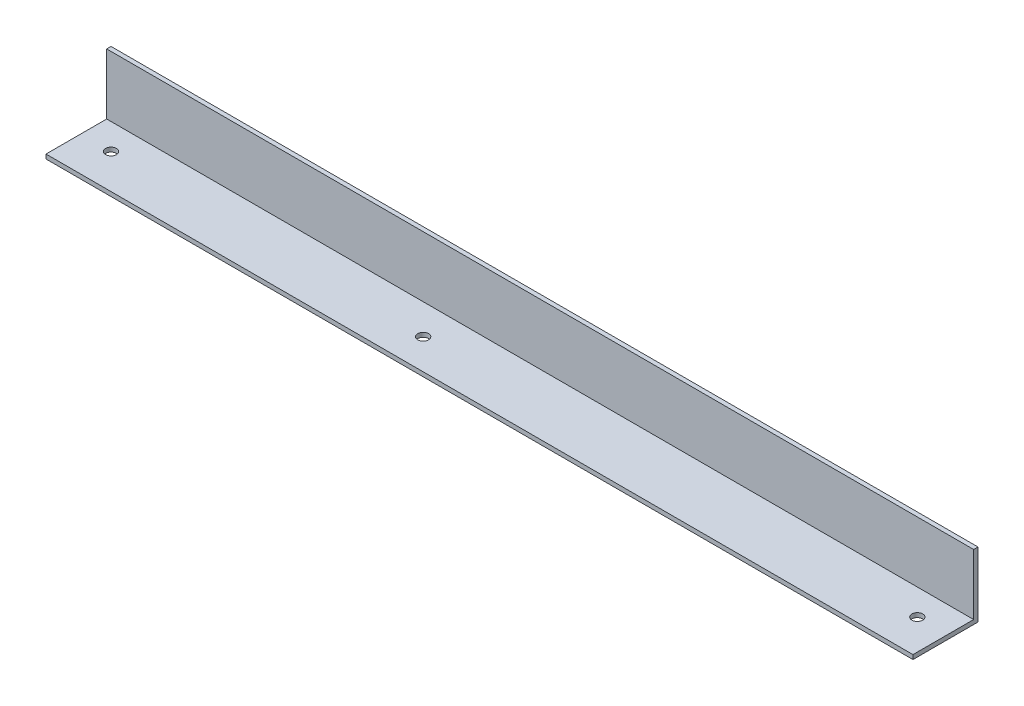
ISO-10303-21;
HEADER;
FILE_DESCRIPTION(('STEP AP214'),'2;1');
FILE_NAME('part.step','',(''),(''),'','','');
FILE_SCHEMA(('AUTOMOTIVE_DESIGN { 1 0 10303 214 1 1 1 1 }'));
ENDSEC;
DATA;
#1=APPLICATION_CONTEXT('core data for automotive mechanical design processes');
#2=APPLICATION_PROTOCOL_DEFINITION('international standard','automotive_design',2000,#1);
#3=PRODUCT_CONTEXT('',#1,'mechanical');
#4=PRODUCT('Part','Part','',(#3));
#5=PRODUCT_RELATED_PRODUCT_CATEGORY('part','',(#4));
#6=PRODUCT_DEFINITION_FORMATION('','',#4);
#7=PRODUCT_DEFINITION_CONTEXT('part definition',#1,'design');
#8=PRODUCT_DEFINITION('design','',#6,#7);
#9=PRODUCT_DEFINITION_SHAPE('','',#8);
#10=(LENGTH_UNIT() NAMED_UNIT(*) SI_UNIT(.MILLI.,.METRE.));
#11=(NAMED_UNIT(*) PLANE_ANGLE_UNIT() SI_UNIT($,.RADIAN.));
#12=(NAMED_UNIT(*) SI_UNIT($,.STERADIAN.) SOLID_ANGLE_UNIT());
#13=UNCERTAINTY_MEASURE_WITH_UNIT(LENGTH_MEASURE(1.E-05),#10,'distance_accuracy_value','');
#14=(GEOMETRIC_REPRESENTATION_CONTEXT(3) GLOBAL_UNCERTAINTY_ASSIGNED_CONTEXT((#13)) GLOBAL_UNIT_ASSIGNED_CONTEXT((#10,
#11,#12)) REPRESENTATION_CONTEXT('',''));
#15=CARTESIAN_POINT('',(0.,0.,0.));
#16=DIRECTION('',(0.,0.,1.));
#17=DIRECTION('',(1.,0.,0.));
#18=AXIS2_PLACEMENT_3D('',#15,#16,#17);
#19=CARTESIAN_POINT('',(0.,0.,1.));
#20=DIRECTION('',(0.,0.,-1.));
#21=DIRECTION('',(-1.,0.,0.));
#22=AXIS2_PLACEMENT_3D('',#19,#20,#21);
#23=PLANE('',#22);
#24=DIRECTION('',(-1.,0.,0.));
#25=VECTOR('',#24,1.);
#26=CARTESIAN_POINT('',(0.,1.,1.));
#27=LINE('',#26,#25);
#28=CARTESIAN_POINT('',(200.,1.,1.));
#29=VERTEX_POINT('',#28);
#30=CARTESIAN_POINT('',(0.,1.,1.));
#31=VERTEX_POINT('',#30);
#32=EDGE_CURVE('E50',#29,#31,#27,.T.);
#33=ORIENTED_EDGE('',*,*,#32,.F.);
#34=DIRECTION('',(0.,1.,0.));
#35=VECTOR('',#34,1.);
#36=CARTESIAN_POINT('',(200.,0.,1.));
#37=LINE('',#36,#35);
#38=CARTESIAN_POINT('',(200.,15.,1.));
#39=VERTEX_POINT('',#38);
#40=EDGE_CURVE('E139',#29,#39,#37,.T.);
#41=ORIENTED_EDGE('',*,*,#40,.T.);
#42=DIRECTION('',(-1.,0.,0.));
#43=VECTOR('',#42,1.);
#44=CARTESIAN_POINT('',(0.,15.,1.));
#45=LINE('',#44,#43);
#46=CARTESIAN_POINT('',(0.,15.,1.));
#47=VERTEX_POINT('',#46);
#48=EDGE_CURVE('E56',#39,#47,#45,.T.);
#49=ORIENTED_EDGE('',*,*,#48,.T.);
#50=DIRECTION('',(0.,-1.,0.));
#51=VECTOR('',#50,1.);
#52=CARTESIAN_POINT('',(0.,0.,1.));
#53=LINE('',#52,#51);
#54=EDGE_CURVE('E85',#47,#31,#53,.T.);
#55=ORIENTED_EDGE('',*,*,#54,.T.);
#56=EDGE_LOOP('',(#33,#41,#49,#55));
#57=FACE_BOUND('',#56,.T.);
#58=ADVANCED_FACE('F35',(#57),#23,.F.);
#59=CARTESIAN_POINT('',(0.,0.,1.));
#60=DIRECTION('',(1.,0.,0.));
#61=DIRECTION('',(0.,0.,-1.));
#62=AXIS2_PLACEMENT_3D('',#59,#60,#61);
#63=PLANE('',#62);
#64=DIRECTION('',(0.,-1.,0.));
#65=VECTOR('',#64,1.);
#66=CARTESIAN_POINT('',(0.,0.,0.));
#67=LINE('',#66,#65);
#68=CARTESIAN_POINT('',(0.,15.,0.));
#69=VERTEX_POINT('',#68);
#70=CARTESIAN_POINT('',(0.,0.,0.));
#71=VERTEX_POINT('',#70);
#72=EDGE_CURVE('E91',#69,#71,#67,.T.);
#73=ORIENTED_EDGE('',*,*,#72,.T.);
#74=DIRECTION('',(0.,0.,-1.));
#75=VECTOR('',#74,1.);
#76=CARTESIAN_POINT('',(0.,0.,1.));
#77=LINE('',#76,#75);
#78=CARTESIAN_POINT('',(0.,0.,15.));
#79=VERTEX_POINT('',#78);
#80=EDGE_CURVE('E11',#79,#71,#77,.T.);
#81=ORIENTED_EDGE('',*,*,#80,.F.);
#82=DIRECTION('',(0.,-1.,0.));
#83=VECTOR('',#82,1.);
#84=CARTESIAN_POINT('',(0.,0.,15.));
#85=LINE('',#84,#83);
#86=CARTESIAN_POINT('',(0.,1.,15.));
#87=VERTEX_POINT('',#86);
#88=EDGE_CURVE('E128',#87,#79,#85,.T.);
#89=ORIENTED_EDGE('',*,*,#88,.F.);
#90=DIRECTION('',(0.,0.,-1.));
#91=VECTOR('',#90,1.);
#92=CARTESIAN_POINT('',(0.,1.,15.));
#93=LINE('',#92,#91);
#94=EDGE_CURVE('E100',#87,#31,#93,.T.);
#95=ORIENTED_EDGE('',*,*,#94,.T.);
#96=ORIENTED_EDGE('',*,*,#54,.F.);
#97=DIRECTION('',(0.,0.,-1.));
#98=VECTOR('',#97,1.);
#99=CARTESIAN_POINT('',(0.,15.,1.));
#100=LINE('',#99,#98);
#101=EDGE_CURVE('E78',#47,#69,#100,.T.);
#102=ORIENTED_EDGE('',*,*,#101,.T.);
#103=EDGE_LOOP('',(#73,#81,#89,#95,#96,#102));
#104=FACE_BOUND('',#103,.T.);
#105=ADVANCED_FACE('F37',(#104),#63,.F.);
#106=CARTESIAN_POINT('',(0.,0.,1.));
#107=DIRECTION('',(0.,1.,0.));
#108=DIRECTION('',(0.,0.,1.));
#109=AXIS2_PLACEMENT_3D('',#106,#107,#108);
#110=PLANE('',#109);
#111=CARTESIAN_POINT('',(7.00000000000001,0.,7.));
#112=DIRECTION('',(0.,-1.,0.));
#113=DIRECTION('',(0.,0.,-1.));
#114=AXIS2_PLACEMENT_3D('',#111,#112,#113);
#115=CIRCLE('',#114,1.24999999999999);
#116=CARTESIAN_POINT('',(7.00000000000001,0.,5.75000000000001));
#117=VERTEX_POINT('',#116);
#118=EDGE_CURVE('E176',#117,#117,#115,.T.);
#119=ORIENTED_EDGE('',*,*,#118,.F.);
#120=EDGE_LOOP('',(#119));
#121=FACE_BOUND('',#120,.T.);
#122=CARTESIAN_POINT('',(80.,0.,8.));
#123=DIRECTION('',(0.,1.,0.));
#124=DIRECTION('',(0.,0.,1.));
#125=AXIS2_PLACEMENT_3D('',#122,#123,#124);
#126=CIRCLE('',#125,1.24999999999999);
#127=CARTESIAN_POINT('',(80.,0.,9.24999999999999));
#128=VERTEX_POINT('',#127);
#129=EDGE_CURVE('E180',#128,#128,#126,.T.);
#130=ORIENTED_EDGE('',*,*,#129,.T.);
#131=EDGE_LOOP('',(#130));
#132=FACE_BOUND('',#131,.T.);
#133=CARTESIAN_POINT('',(193.,0.,7.));
#134=DIRECTION('',(0.,-1.,0.));
#135=DIRECTION('',(0.,0.,-1.));
#136=AXIS2_PLACEMENT_3D('',#133,#134,#135);
#137=CIRCLE('',#136,1.24999999999997);
#138=CARTESIAN_POINT('',(193.,0.,5.75000000000003));
#139=VERTEX_POINT('',#138);
#140=EDGE_CURVE('E183',#139,#139,#137,.T.);
#141=ORIENTED_EDGE('',*,*,#140,.F.);
#142=EDGE_LOOP('',(#141));
#143=FACE_BOUND('',#142,.T.);
#144=DIRECTION('',(1.,0.,0.));
#145=VECTOR('',#144,1.);
#146=CARTESIAN_POINT('',(0.,0.,0.));
#147=LINE('',#146,#145);
#148=CARTESIAN_POINT('',(200.,0.,0.));
#149=VERTEX_POINT('',#148);
#150=EDGE_CURVE('E95',#71,#149,#147,.T.);
#151=ORIENTED_EDGE('',*,*,#150,.T.);
#152=DIRECTION('',(0.,0.,-1.));
#153=VECTOR('',#152,1.);
#154=CARTESIAN_POINT('',(200.,0.,1.));
#155=LINE('',#154,#153);
#156=CARTESIAN_POINT('',(200.,0.,15.));
#157=VERTEX_POINT('',#156);
#158=EDGE_CURVE('E43',#157,#149,#155,.T.);
#159=ORIENTED_EDGE('',*,*,#158,.F.);
#160=DIRECTION('',(1.,0.,0.));
#161=VECTOR('',#160,1.);
#162=CARTESIAN_POINT('',(0.,0.,15.));
#163=LINE('',#162,#161);
#164=EDGE_CURVE('E120',#79,#157,#163,.T.);
#165=ORIENTED_EDGE('',*,*,#164,.F.);
#166=ORIENTED_EDGE('',*,*,#80,.T.);
#167=EDGE_LOOP('',(#151,#159,#165,#166));
#168=FACE_BOUND('',#167,.T.);
#169=ADVANCED_FACE('F118',(#121,#132,#143,#168),#110,.F.);
#170=CARTESIAN_POINT('',(200.,0.,1.));
#171=DIRECTION('',(-1.,0.,0.));
#172=DIRECTION('',(0.,0.,1.));
#173=AXIS2_PLACEMENT_3D('',#170,#171,#172);
#174=PLANE('',#173);
#175=DIRECTION('',(0.,1.,0.));
#176=VECTOR('',#175,1.);
#177=CARTESIAN_POINT('',(200.,0.,0.));
#178=LINE('',#177,#176);
#179=CARTESIAN_POINT('',(200.,15.,0.));
#180=VERTEX_POINT('',#179);
#181=EDGE_CURVE('E86',#149,#180,#178,.T.);
#182=ORIENTED_EDGE('',*,*,#181,.T.);
#183=DIRECTION('',(0.,0.,-1.));
#184=VECTOR('',#183,1.);
#185=CARTESIAN_POINT('',(200.,15.,1.));
#186=LINE('',#185,#184);
#187=EDGE_CURVE('E81',#39,#180,#186,.T.);
#188=ORIENTED_EDGE('',*,*,#187,.F.);
#189=ORIENTED_EDGE('',*,*,#40,.F.);
#190=DIRECTION('',(0.,0.,-1.));
#191=VECTOR('',#190,1.);
#192=CARTESIAN_POINT('',(200.,1.,15.));
#193=LINE('',#192,#191);
#194=CARTESIAN_POINT('',(200.,1.,15.));
#195=VERTEX_POINT('',#194);
#196=EDGE_CURVE('E96',#195,#29,#193,.T.);
#197=ORIENTED_EDGE('',*,*,#196,.F.);
#198=DIRECTION('',(0.,1.,0.));
#199=VECTOR('',#198,1.);
#200=CARTESIAN_POINT('',(200.,0.,15.));
#201=LINE('',#200,#199);
#202=EDGE_CURVE('E114',#157,#195,#201,.T.);
#203=ORIENTED_EDGE('',*,*,#202,.F.);
#204=ORIENTED_EDGE('',*,*,#158,.T.);
#205=EDGE_LOOP('',(#182,#188,#189,#197,#203,#204));
#206=FACE_BOUND('',#205,.T.);
#207=ADVANCED_FACE('F110',(#206),#174,.F.);
#208=CARTESIAN_POINT('',(0.,15.,1.));
#209=DIRECTION('',(0.,-1.,0.));
#210=DIRECTION('',(0.,0.,-1.));
#211=AXIS2_PLACEMENT_3D('',#208,#209,#210);
#212=PLANE('',#211);
#213=DIRECTION('',(-1.,0.,0.));
#214=VECTOR('',#213,1.);
#215=CARTESIAN_POINT('',(0.,15.,0.));
#216=LINE('',#215,#214);
#217=EDGE_CURVE('E75',#180,#69,#216,.T.);
#218=ORIENTED_EDGE('',*,*,#217,.T.);
#219=ORIENTED_EDGE('',*,*,#101,.F.);
#220=ORIENTED_EDGE('',*,*,#48,.F.);
#221=ORIENTED_EDGE('',*,*,#187,.T.);
#222=EDGE_LOOP('',(#218,#219,#220,#221));
#223=FACE_BOUND('',#222,.T.);
#224=ADVANCED_FACE('F77',(#223),#212,.F.);
#225=CARTESIAN_POINT('',(0.,0.,0.));
#226=DIRECTION('',(0.,0.,-1.));
#227=DIRECTION('',(-1.,0.,0.));
#228=AXIS2_PLACEMENT_3D('',#225,#226,#227);
#229=PLANE('',#228);
#230=ORIENTED_EDGE('',*,*,#72,.F.);
#231=ORIENTED_EDGE('',*,*,#217,.F.);
#232=ORIENTED_EDGE('',*,*,#181,.F.);
#233=ORIENTED_EDGE('',*,*,#150,.F.);
#234=EDGE_LOOP('',(#230,#231,#232,#233));
#235=FACE_BOUND('',#234,.T.);
#236=ADVANCED_FACE('F94',(#235),#229,.T.);
#237=CARTESIAN_POINT('',(0.,1.,15.));
#238=DIRECTION('',(0.,-1.,0.));
#239=DIRECTION('',(0.,0.,-1.));
#240=AXIS2_PLACEMENT_3D('',#237,#238,#239);
#241=PLANE('',#240);
#242=CARTESIAN_POINT('',(7.00000000000001,1.,7.));
#243=DIRECTION('',(0.,-1.,0.));
#244=DIRECTION('',(0.,0.,-1.));
#245=AXIS2_PLACEMENT_3D('',#242,#243,#244);
#246=CIRCLE('',#245,1.24999999999999);
#247=CARTESIAN_POINT('',(7.00000000000001,1.,5.75000000000001));
#248=VERTEX_POINT('',#247);
#249=EDGE_CURVE('E192',#248,#248,#246,.T.);
#250=ORIENTED_EDGE('',*,*,#249,.T.);
#251=EDGE_LOOP('',(#250));
#252=FACE_BOUND('',#251,.T.);
#253=CARTESIAN_POINT('',(80.,1.,8.));
#254=DIRECTION('',(0.,1.,0.));
#255=DIRECTION('',(0.,0.,1.));
#256=AXIS2_PLACEMENT_3D('',#253,#254,#255);
#257=CIRCLE('',#256,1.24999999999999);
#258=CARTESIAN_POINT('',(80.,1.,9.24999999999999));
#259=VERTEX_POINT('',#258);
#260=EDGE_CURVE('E187',#259,#259,#257,.T.);
#261=ORIENTED_EDGE('',*,*,#260,.F.);
#262=EDGE_LOOP('',(#261));
#263=FACE_BOUND('',#262,.T.);
#264=CARTESIAN_POINT('',(193.,1.,7.));
#265=DIRECTION('',(0.,-1.,0.));
#266=DIRECTION('',(0.,0.,-1.));
#267=AXIS2_PLACEMENT_3D('',#264,#265,#266);
#268=CIRCLE('',#267,1.24999999999999);
#269=CARTESIAN_POINT('',(193.,1.,5.75000000000001));
#270=VERTEX_POINT('',#269);
#271=EDGE_CURVE('E137',#270,#270,#268,.T.);
#272=ORIENTED_EDGE('',*,*,#271,.T.);
#273=EDGE_LOOP('',(#272));
#274=FACE_BOUND('',#273,.T.);
#275=ORIENTED_EDGE('',*,*,#32,.T.);
#276=ORIENTED_EDGE('',*,*,#94,.F.);
#277=DIRECTION('',(-1.,0.,0.));
#278=VECTOR('',#277,1.);
#279=CARTESIAN_POINT('',(0.,1.,15.));
#280=LINE('',#279,#278);
#281=EDGE_CURVE('E130',#195,#87,#280,.T.);
#282=ORIENTED_EDGE('',*,*,#281,.F.);
#283=ORIENTED_EDGE('',*,*,#196,.T.);
#284=EDGE_LOOP('',(#275,#276,#282,#283));
#285=FACE_BOUND('',#284,.T.);
#286=ADVANCED_FACE('F142',(#252,#263,#274,#285),#241,.F.);
#287=CARTESIAN_POINT('',(0.,0.,15.));
#288=DIRECTION('',(0.,0.,-1.));
#289=DIRECTION('',(-1.,0.,0.));
#290=AXIS2_PLACEMENT_3D('',#287,#288,#289);
#291=PLANE('',#290);
#292=ORIENTED_EDGE('',*,*,#88,.T.);
#293=ORIENTED_EDGE('',*,*,#164,.T.);
#294=ORIENTED_EDGE('',*,*,#202,.T.);
#295=ORIENTED_EDGE('',*,*,#281,.T.);
#296=EDGE_LOOP('',(#292,#293,#294,#295));
#297=FACE_BOUND('',#296,.T.);
#298=ADVANCED_FACE('F125',(#297),#291,.F.);
#299=CARTESIAN_POINT('',(193.,0.,7.));
#300=DIRECTION('',(0.,-1.,0.));
#301=DIRECTION('',(0.,0.,-1.));
#302=AXIS2_PLACEMENT_3D('',#299,#300,#301);
#303=CYLINDRICAL_SURFACE('',#302,1.24999999999999);
#304=ORIENTED_EDGE('',*,*,#140,.T.);
#305=EDGE_LOOP('',(#304));
#306=FACE_BOUND('',#305,.T.);
#307=ORIENTED_EDGE('',*,*,#271,.F.);
#308=EDGE_LOOP('',(#307));
#309=FACE_BOUND('',#308,.T.);
#310=ADVANCED_FACE('F155',(#306,#309),#303,.F.);
#311=CARTESIAN_POINT('',(80.,1.,8.));
#312=DIRECTION('',(0.,1.,0.));
#313=DIRECTION('',(0.,0.,1.));
#314=AXIS2_PLACEMENT_3D('',#311,#312,#313);
#315=CYLINDRICAL_SURFACE('',#314,1.24999999999999);
#316=ORIENTED_EDGE('',*,*,#129,.F.);
#317=EDGE_LOOP('',(#316));
#318=FACE_BOUND('',#317,.T.);
#319=ORIENTED_EDGE('',*,*,#260,.T.);
#320=EDGE_LOOP('',(#319));
#321=FACE_BOUND('',#320,.T.);
#322=ADVANCED_FACE('F198',(#318,#321),#315,.F.);
#323=CARTESIAN_POINT('',(7.00000000000001,0.,7.));
#324=DIRECTION('',(0.,-1.,0.));
#325=DIRECTION('',(0.,0.,-1.));
#326=AXIS2_PLACEMENT_3D('',#323,#324,#325);
#327=CYLINDRICAL_SURFACE('',#326,1.24999999999999);
#328=ORIENTED_EDGE('',*,*,#118,.T.);
#329=EDGE_LOOP('',(#328));
#330=FACE_BOUND('',#329,.T.);
#331=ORIENTED_EDGE('',*,*,#249,.F.);
#332=EDGE_LOOP('',(#331));
#333=FACE_BOUND('',#332,.T.);
#334=ADVANCED_FACE('F195',(#330,#333),#327,.F.);
#335=CLOSED_SHELL('',(#58,#105,#169,#207,#224,#236,#286,#298,#310,#322,#334));
#336=MANIFOLD_SOLID_BREP('B2',#335);
#337=ADVANCED_BREP_SHAPE_REPRESENTATION('',(#18,#336),#14);
#338=SHAPE_DEFINITION_REPRESENTATION(#9,#337);
ENDSEC;
END-ISO-10303-21;
